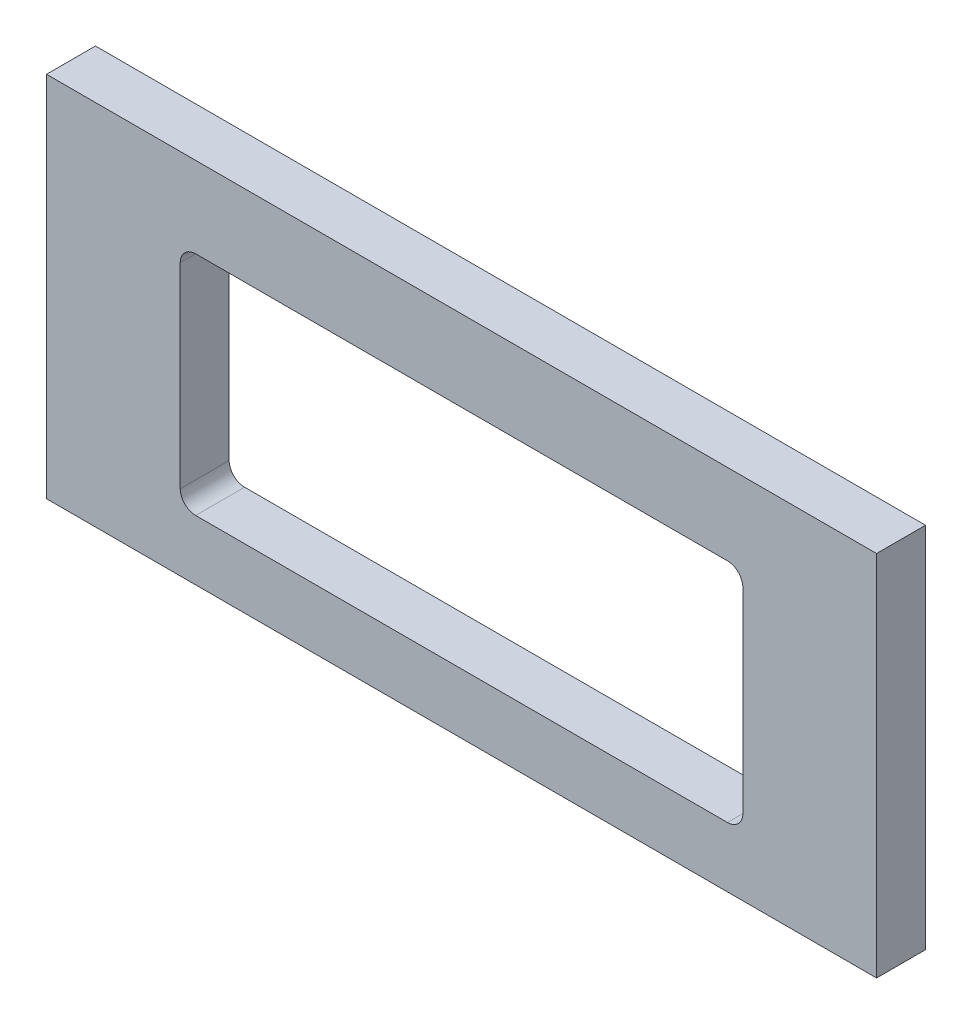
ISO-10303-21;
HEADER;
FILE_DESCRIPTION(('STEP AP214'),'2;1');
FILE_NAME('part.step','',(''),(''),'','','');
FILE_SCHEMA(('AUTOMOTIVE_DESIGN { 1 0 10303 214 1 1 1 1 }'));
ENDSEC;
DATA;
#1=APPLICATION_CONTEXT('core data for automotive mechanical design processes');
#2=APPLICATION_PROTOCOL_DEFINITION('international standard','automotive_design',2000,#1);
#3=PRODUCT_CONTEXT('',#1,'mechanical');
#4=PRODUCT('Part','Part','',(#3));
#5=PRODUCT_RELATED_PRODUCT_CATEGORY('part','',(#4));
#6=PRODUCT_DEFINITION_FORMATION('','',#4);
#7=PRODUCT_DEFINITION_CONTEXT('part definition',#1,'design');
#8=PRODUCT_DEFINITION('design','',#6,#7);
#9=PRODUCT_DEFINITION_SHAPE('','',#8);
#10=(LENGTH_UNIT() NAMED_UNIT(*) SI_UNIT(.MILLI.,.METRE.));
#11=(NAMED_UNIT(*) PLANE_ANGLE_UNIT() SI_UNIT($,.RADIAN.));
#12=(NAMED_UNIT(*) SI_UNIT($,.STERADIAN.) SOLID_ANGLE_UNIT());
#13=UNCERTAINTY_MEASURE_WITH_UNIT(LENGTH_MEASURE(1.E-05),#10,'distance_accuracy_value','');
#14=(GEOMETRIC_REPRESENTATION_CONTEXT(3) GLOBAL_UNCERTAINTY_ASSIGNED_CONTEXT((#13)) GLOBAL_UNIT_ASSIGNED_CONTEXT((#10,
#11,#12)) REPRESENTATION_CONTEXT('',''));
#15=CARTESIAN_POINT('',(0.,0.,0.));
#16=DIRECTION('',(0.,0.,1.));
#17=DIRECTION('',(1.,0.,0.));
#18=AXIS2_PLACEMENT_3D('',#15,#16,#17);
#19=CARTESIAN_POINT('',(53.85,47.7,6.35));
#20=DIRECTION('',(0.,-1.,0.));
#21=DIRECTION('',(1.,0.,0.));
#22=AXIS2_PLACEMENT_3D('',#19,#20,#21);
#23=PLANE('',#22);
#24=DIRECTION('',(-1.,0.,0.));
#25=VECTOR('',#24,1.);
#26=CARTESIAN_POINT('',(53.85,47.7,0.));
#27=LINE('',#26,#25);
#28=CARTESIAN_POINT('',(53.85,47.7,0.));
#29=VERTEX_POINT('',#28);
#30=CARTESIAN_POINT('',(-53.85,47.7,0.));
#31=VERTEX_POINT('',#30);
#32=EDGE_CURVE('E167',#29,#31,#27,.T.);
#33=ORIENTED_EDGE('',*,*,#32,.T.);
#34=DIRECTION('',(0.,0.,-1.));
#35=VECTOR('',#34,1.);
#36=CARTESIAN_POINT('',(-53.85,47.7,6.35));
#37=LINE('',#36,#35);
#38=CARTESIAN_POINT('',(-53.85,47.7,6.35));
#39=VERTEX_POINT('',#38);
#40=EDGE_CURVE('E12',#39,#31,#37,.T.);
#41=ORIENTED_EDGE('',*,*,#40,.F.);
#42=DIRECTION('',(-1.,0.,0.));
#43=VECTOR('',#42,1.);
#44=CARTESIAN_POINT('',(53.85,47.7,6.35));
#45=LINE('',#44,#43);
#46=CARTESIAN_POINT('',(53.85,47.7,6.35));
#47=VERTEX_POINT('',#46);
#48=EDGE_CURVE('E228',#47,#39,#45,.T.);
#49=ORIENTED_EDGE('',*,*,#48,.F.);
#50=DIRECTION('',(0.,0.,-1.));
#51=VECTOR('',#50,1.);
#52=CARTESIAN_POINT('',(53.85,47.7,6.35));
#53=LINE('',#52,#51);
#54=EDGE_CURVE('E239',#47,#29,#53,.T.);
#55=ORIENTED_EDGE('',*,*,#54,.T.);
#56=EDGE_LOOP('',(#33,#41,#49,#55));
#57=FACE_BOUND('',#56,.T.);
#58=ADVANCED_FACE('F73',(#57),#23,.F.);
#59=CARTESIAN_POINT('',(-53.85,0.,6.35));
#60=DIRECTION('',(-1.,0.,0.));
#61=DIRECTION('',(0.,-1.,0.));
#62=AXIS2_PLACEMENT_3D('',#59,#60,#61);
#63=PLANE('',#62);
#64=DIRECTION('',(0.,1.,0.));
#65=VECTOR('',#64,1.);
#66=CARTESIAN_POINT('',(-53.85,0.,0.));
#67=LINE('',#66,#65);
#68=CARTESIAN_POINT('',(-53.85,0.,0.));
#69=VERTEX_POINT('',#68);
#70=EDGE_CURVE('E242',#69,#31,#67,.T.);
#71=ORIENTED_EDGE('',*,*,#70,.F.);
#72=DIRECTION('',(0.,0.,-1.));
#73=VECTOR('',#72,1.);
#74=CARTESIAN_POINT('',(-53.85,0.,6.35));
#75=LINE('',#74,#73);
#76=CARTESIAN_POINT('',(-53.85,0.,6.35));
#77=VERTEX_POINT('',#76);
#78=EDGE_CURVE('E80',#77,#69,#75,.T.);
#79=ORIENTED_EDGE('',*,*,#78,.F.);
#80=DIRECTION('',(0.,1.,0.));
#81=VECTOR('',#80,1.);
#82=CARTESIAN_POINT('',(-53.85,0.,6.35));
#83=LINE('',#82,#81);
#84=EDGE_CURVE('E230',#77,#39,#83,.T.);
#85=ORIENTED_EDGE('',*,*,#84,.T.);
#86=ORIENTED_EDGE('',*,*,#40,.T.);
#87=EDGE_LOOP('',(#71,#79,#85,#86));
#88=FACE_BOUND('',#87,.T.);
#89=ADVANCED_FACE('F259',(#88),#63,.T.);
#90=CARTESIAN_POINT('',(53.85,0.,6.35));
#91=DIRECTION('',(0.,-1.,0.));
#92=DIRECTION('',(0.,0.,-1.));
#93=AXIS2_PLACEMENT_3D('',#90,#91,#92);
#94=PLANE('',#93);
#95=DIRECTION('',(-1.,0.,0.));
#96=VECTOR('',#95,1.);
#97=CARTESIAN_POINT('',(53.85,0.,0.));
#98=LINE('',#97,#96);
#99=CARTESIAN_POINT('',(53.85,0.,0.));
#100=VERTEX_POINT('',#99);
#101=EDGE_CURVE('E245',#100,#69,#98,.T.);
#102=ORIENTED_EDGE('',*,*,#101,.F.);
#103=DIRECTION('',(0.,0.,-1.));
#104=VECTOR('',#103,1.);
#105=CARTESIAN_POINT('',(53.85,0.,6.35));
#106=LINE('',#105,#104);
#107=CARTESIAN_POINT('',(53.85,0.,6.35));
#108=VERTEX_POINT('',#107);
#109=EDGE_CURVE('E251',#108,#100,#106,.T.);
#110=ORIENTED_EDGE('',*,*,#109,.F.);
#111=DIRECTION('',(-1.,0.,0.));
#112=VECTOR('',#111,1.);
#113=CARTESIAN_POINT('',(53.85,0.,6.35));
#114=LINE('',#113,#112);
#115=EDGE_CURVE('E234',#108,#77,#114,.T.);
#116=ORIENTED_EDGE('',*,*,#115,.T.);
#117=ORIENTED_EDGE('',*,*,#78,.T.);
#118=EDGE_LOOP('',(#102,#110,#116,#117));
#119=FACE_BOUND('',#118,.T.);
#120=ADVANCED_FACE('F255',(#119),#94,.T.);
#121=CARTESIAN_POINT('',(53.85,0.,6.35));
#122=DIRECTION('',(-1.,0.,0.));
#123=DIRECTION('',(0.,-1.,0.));
#124=AXIS2_PLACEMENT_3D('',#121,#122,#123);
#125=PLANE('',#124);
#126=DIRECTION('',(0.,1.,0.));
#127=VECTOR('',#126,1.);
#128=CARTESIAN_POINT('',(53.85,0.,0.));
#129=LINE('',#128,#127);
#130=EDGE_CURVE('E231',#100,#29,#129,.T.);
#131=ORIENTED_EDGE('',*,*,#130,.T.);
#132=ORIENTED_EDGE('',*,*,#54,.F.);
#133=DIRECTION('',(0.,1.,0.));
#134=VECTOR('',#133,1.);
#135=CARTESIAN_POINT('',(53.85,0.,6.35));
#136=LINE('',#135,#134);
#137=EDGE_CURVE('E237',#108,#47,#136,.T.);
#138=ORIENTED_EDGE('',*,*,#137,.F.);
#139=ORIENTED_EDGE('',*,*,#109,.T.);
#140=EDGE_LOOP('',(#131,#132,#138,#139));
#141=FACE_BOUND('',#140,.T.);
#142=ADVANCED_FACE('F267',(#141),#125,.F.);
#143=CARTESIAN_POINT('',(0.,0.,6.35));
#144=DIRECTION('',(0.,0.,-1.));
#145=DIRECTION('',(-1.,0.,0.));
#146=AXIS2_PLACEMENT_3D('',#143,#144,#145);
#147=PLANE('',#146);
#148=CARTESIAN_POINT('',(34.5000120000002,9.8,6.35));
#149=DIRECTION('',(0.,0.,1.));
#150=DIRECTION('',(1.,0.,0.));
#151=AXIS2_PLACEMENT_3D('',#148,#149,#150);
#152=CIRCLE('',#151,2.);
#153=CARTESIAN_POINT('',(34.5000120000002,7.8,6.35));
#154=VERTEX_POINT('',#153);
#155=CARTESIAN_POINT('',(36.5000120000002,9.8,6.35));
#156=VERTEX_POINT('',#155);
#157=EDGE_CURVE('E163',#154,#156,#152,.T.);
#158=ORIENTED_EDGE('',*,*,#157,.F.);
#159=DIRECTION('',(-1.,0.,0.));
#160=VECTOR('',#159,1.);
#161=CARTESIAN_POINT('',(0.,7.8,6.35));
#162=LINE('',#161,#160);
#163=CARTESIAN_POINT('',(-34.4999879999998,7.79999999999999,6.35));
#164=VERTEX_POINT('',#163);
#165=EDGE_CURVE('E171',#154,#164,#162,.T.);
#166=ORIENTED_EDGE('',*,*,#165,.T.);
#167=CARTESIAN_POINT('',(-34.4999879999998,9.79999999999999,6.35));
#168=DIRECTION('',(0.,0.,1.));
#169=DIRECTION('',(1.,0.,0.));
#170=AXIS2_PLACEMENT_3D('',#167,#168,#169);
#171=CIRCLE('',#170,2.);
#172=CARTESIAN_POINT('',(-36.4999879999998,9.79999999999999,6.35));
#173=VERTEX_POINT('',#172);
#174=EDGE_CURVE('E195',#164,#173,#171,.F.);
#175=ORIENTED_EDGE('',*,*,#174,.T.);
#176=DIRECTION('',(0.,1.,0.));
#177=VECTOR('',#176,1.);
#178=CARTESIAN_POINT('',(-36.4999879999998,0.,6.35));
#179=LINE('',#178,#177);
#180=CARTESIAN_POINT('',(-36.4999879999998,35.2,6.35));
#181=VERTEX_POINT('',#180);
#182=EDGE_CURVE('E87',#173,#181,#179,.T.);
#183=ORIENTED_EDGE('',*,*,#182,.T.);
#184=CARTESIAN_POINT('',(-34.4999879999998,35.2,6.35));
#185=DIRECTION('',(0.,0.,1.));
#186=DIRECTION('',(1.,0.,0.));
#187=AXIS2_PLACEMENT_3D('',#184,#185,#186);
#188=CIRCLE('',#187,2.00000000000001);
#189=CARTESIAN_POINT('',(-34.4999879999998,37.2,6.35));
#190=VERTEX_POINT('',#189);
#191=EDGE_CURVE('E191',#181,#190,#188,.F.);
#192=ORIENTED_EDGE('',*,*,#191,.T.);
#193=DIRECTION('',(-1.,0.,0.));
#194=VECTOR('',#193,1.);
#195=CARTESIAN_POINT('',(0.,37.2,6.35));
#196=LINE('',#195,#194);
#197=CARTESIAN_POINT('',(34.5000120000002,37.2,6.35));
#198=VERTEX_POINT('',#197);
#199=EDGE_CURVE('E189',#198,#190,#196,.T.);
#200=ORIENTED_EDGE('',*,*,#199,.F.);
#201=CARTESIAN_POINT('',(34.5000120000002,35.2,6.35));
#202=DIRECTION('',(0.,0.,1.));
#203=DIRECTION('',(1.,0.,0.));
#204=AXIS2_PLACEMENT_3D('',#201,#202,#203);
#205=CIRCLE('',#204,2.);
#206=CARTESIAN_POINT('',(36.5000120000002,35.2,6.35));
#207=VERTEX_POINT('',#206);
#208=EDGE_CURVE('E185',#198,#207,#205,.F.);
#209=ORIENTED_EDGE('',*,*,#208,.T.);
#210=DIRECTION('',(0.,1.,0.));
#211=VECTOR('',#210,1.);
#212=CARTESIAN_POINT('',(36.5000120000002,0.,6.35));
#213=LINE('',#212,#211);
#214=EDGE_CURVE('E183',#156,#207,#213,.T.);
#215=ORIENTED_EDGE('',*,*,#214,.F.);
#216=EDGE_LOOP('',(#158,#166,#175,#183,#192,#200,#209,#215));
#217=FACE_BOUND('',#216,.T.);
#218=ORIENTED_EDGE('',*,*,#48,.T.);
#219=ORIENTED_EDGE('',*,*,#84,.F.);
#220=ORIENTED_EDGE('',*,*,#115,.F.);
#221=ORIENTED_EDGE('',*,*,#137,.T.);
#222=EDGE_LOOP('',(#218,#219,#220,#221));
#223=FACE_BOUND('',#222,.T.);
#224=ADVANCED_FACE('F180',(#217,#223),#147,.F.);
#225=CARTESIAN_POINT('',(0.,0.,0.));
#226=DIRECTION('',(0.,0.,-1.));
#227=DIRECTION('',(-1.,0.,0.));
#228=AXIS2_PLACEMENT_3D('',#225,#226,#227);
#229=PLANE('',#228);
#230=DIRECTION('',(-1.,0.,0.));
#231=VECTOR('',#230,1.);
#232=CARTESIAN_POINT('',(0.,7.8,0.));
#233=LINE('',#232,#231);
#234=CARTESIAN_POINT('',(34.5000120000002,7.8,0.));
#235=VERTEX_POINT('',#234);
#236=CARTESIAN_POINT('',(-34.4999879999998,7.79999999999999,0.));
#237=VERTEX_POINT('',#236);
#238=EDGE_CURVE('E95',#235,#237,#233,.T.);
#239=ORIENTED_EDGE('',*,*,#238,.F.);
#240=CARTESIAN_POINT('',(34.5000120000002,9.8,0.));
#241=DIRECTION('',(0.,0.,1.));
#242=DIRECTION('',(1.,0.,0.));
#243=AXIS2_PLACEMENT_3D('',#240,#241,#242);
#244=CIRCLE('',#243,2.);
#245=CARTESIAN_POINT('',(36.5000120000002,9.8,0.));
#246=VERTEX_POINT('',#245);
#247=EDGE_CURVE('E166',#235,#246,#244,.T.);
#248=ORIENTED_EDGE('',*,*,#247,.T.);
#249=DIRECTION('',(0.,1.,0.));
#250=VECTOR('',#249,1.);
#251=CARTESIAN_POINT('',(36.5000120000002,0.,0.));
#252=LINE('',#251,#250);
#253=CARTESIAN_POINT('',(36.5000120000002,35.2,0.));
#254=VERTEX_POINT('',#253);
#255=EDGE_CURVE('E199',#246,#254,#252,.T.);
#256=ORIENTED_EDGE('',*,*,#255,.T.);
#257=CARTESIAN_POINT('',(34.5000120000002,35.2,0.));
#258=DIRECTION('',(0.,0.,1.));
#259=DIRECTION('',(1.,0.,0.));
#260=AXIS2_PLACEMENT_3D('',#257,#258,#259);
#261=CIRCLE('',#260,2.);
#262=CARTESIAN_POINT('',(34.5000120000002,37.2,0.));
#263=VERTEX_POINT('',#262);
#264=EDGE_CURVE('E202',#263,#254,#261,.F.);
#265=ORIENTED_EDGE('',*,*,#264,.F.);
#266=DIRECTION('',(-1.,0.,0.));
#267=VECTOR('',#266,1.);
#268=CARTESIAN_POINT('',(0.,37.2,0.));
#269=LINE('',#268,#267);
#270=CARTESIAN_POINT('',(-34.4999879999998,37.2,0.));
#271=VERTEX_POINT('',#270);
#272=EDGE_CURVE('E205',#263,#271,#269,.T.);
#273=ORIENTED_EDGE('',*,*,#272,.T.);
#274=CARTESIAN_POINT('',(-34.4999879999998,35.2,0.));
#275=DIRECTION('',(0.,0.,1.));
#276=DIRECTION('',(1.,0.,0.));
#277=AXIS2_PLACEMENT_3D('',#274,#275,#276);
#278=CIRCLE('',#277,2.00000000000001);
#279=CARTESIAN_POINT('',(-36.4999879999998,35.2,0.));
#280=VERTEX_POINT('',#279);
#281=EDGE_CURVE('E208',#280,#271,#278,.F.);
#282=ORIENTED_EDGE('',*,*,#281,.F.);
#283=DIRECTION('',(0.,1.,0.));
#284=VECTOR('',#283,1.);
#285=CARTESIAN_POINT('',(-36.4999879999998,0.,0.));
#286=LINE('',#285,#284);
#287=CARTESIAN_POINT('',(-36.4999879999998,9.79999999999999,0.));
#288=VERTEX_POINT('',#287);
#289=EDGE_CURVE('E211',#288,#280,#286,.T.);
#290=ORIENTED_EDGE('',*,*,#289,.F.);
#291=CARTESIAN_POINT('',(-34.4999879999998,9.79999999999999,0.));
#292=DIRECTION('',(0.,0.,1.));
#293=DIRECTION('',(1.,0.,0.));
#294=AXIS2_PLACEMENT_3D('',#291,#292,#293);
#295=CIRCLE('',#294,2.);
#296=EDGE_CURVE('E177',#237,#288,#295,.F.);
#297=ORIENTED_EDGE('',*,*,#296,.F.);
#298=EDGE_LOOP('',(#239,#248,#256,#265,#273,#282,#290,#297));
#299=FACE_BOUND('',#298,.T.);
#300=ORIENTED_EDGE('',*,*,#32,.F.);
#301=ORIENTED_EDGE('',*,*,#130,.F.);
#302=ORIENTED_EDGE('',*,*,#101,.T.);
#303=ORIENTED_EDGE('',*,*,#70,.T.);
#304=EDGE_LOOP('',(#300,#301,#302,#303));
#305=FACE_BOUND('',#304,.T.);
#306=ADVANCED_FACE('F264',(#299,#305),#229,.T.);
#307=CARTESIAN_POINT('',(0.,7.8,6.35));
#308=DIRECTION('',(0.,-1.,0.));
#309=DIRECTION('',(1.,0.,0.));
#310=AXIS2_PLACEMENT_3D('',#307,#308,#309);
#311=PLANE('',#310);
#312=ORIENTED_EDGE('',*,*,#238,.T.);
#313=DIRECTION('',(0.,0.,-1.));
#314=VECTOR('',#313,1.);
#315=CARTESIAN_POINT('',(-34.4999879999998,7.79999999999999,6.35));
#316=LINE('',#315,#314);
#317=EDGE_CURVE('E173',#164,#237,#316,.T.);
#318=ORIENTED_EDGE('',*,*,#317,.F.);
#319=ORIENTED_EDGE('',*,*,#165,.F.);
#320=DIRECTION('',(0.,0.,-1.));
#321=VECTOR('',#320,1.);
#322=CARTESIAN_POINT('',(34.5000120000002,7.8,6.35));
#323=LINE('',#322,#321);
#324=EDGE_CURVE('E159',#154,#235,#323,.T.);
#325=ORIENTED_EDGE('',*,*,#324,.T.);
#326=EDGE_LOOP('',(#312,#318,#319,#325));
#327=FACE_BOUND('',#326,.T.);
#328=ADVANCED_FACE('F172',(#327),#311,.F.);
#329=CARTESIAN_POINT('',(34.5000120000002,9.8,6.35));
#330=DIRECTION('',(0.,0.,-1.));
#331=DIRECTION('',(-1.,0.,0.));
#332=AXIS2_PLACEMENT_3D('',#329,#330,#331);
#333=CYLINDRICAL_SURFACE('',#332,2.);
#334=ORIENTED_EDGE('',*,*,#247,.F.);
#335=ORIENTED_EDGE('',*,*,#324,.F.);
#336=ORIENTED_EDGE('',*,*,#157,.T.);
#337=DIRECTION('',(0.,0.,-1.));
#338=VECTOR('',#337,1.);
#339=CARTESIAN_POINT('',(36.5000120000002,9.8,6.35));
#340=LINE('',#339,#338);
#341=EDGE_CURVE('E168',#156,#246,#340,.T.);
#342=ORIENTED_EDGE('',*,*,#341,.T.);
#343=EDGE_LOOP('',(#334,#335,#336,#342));
#344=FACE_BOUND('',#343,.T.);
#345=ADVANCED_FACE('F161',(#344),#333,.F.);
#346=CARTESIAN_POINT('',(36.5000120000002,0.,6.35));
#347=DIRECTION('',(-1.,0.,0.));
#348=DIRECTION('',(0.,0.,1.));
#349=AXIS2_PLACEMENT_3D('',#346,#347,#348);
#350=PLANE('',#349);
#351=ORIENTED_EDGE('',*,*,#255,.F.);
#352=ORIENTED_EDGE('',*,*,#341,.F.);
#353=ORIENTED_EDGE('',*,*,#214,.T.);
#354=DIRECTION('',(0.,0.,-1.));
#355=VECTOR('',#354,1.);
#356=CARTESIAN_POINT('',(36.5000120000002,35.2,6.35));
#357=LINE('',#356,#355);
#358=EDGE_CURVE('E225',#207,#254,#357,.T.);
#359=ORIENTED_EDGE('',*,*,#358,.T.);
#360=EDGE_LOOP('',(#351,#352,#353,#359));
#361=FACE_BOUND('',#360,.T.);
#362=ADVANCED_FACE('F325',(#361),#350,.T.);
#363=CARTESIAN_POINT('',(34.5000120000002,35.2,6.35));
#364=DIRECTION('',(0.,0.,-1.));
#365=DIRECTION('',(-1.,0.,0.));
#366=AXIS2_PLACEMENT_3D('',#363,#364,#365);
#367=CYLINDRICAL_SURFACE('',#366,2.);
#368=ORIENTED_EDGE('',*,*,#264,.T.);
#369=ORIENTED_EDGE('',*,*,#358,.F.);
#370=ORIENTED_EDGE('',*,*,#208,.F.);
#371=DIRECTION('',(0.,0.,-1.));
#372=VECTOR('',#371,1.);
#373=CARTESIAN_POINT('',(34.5000120000002,37.2,6.35));
#374=LINE('',#373,#372);
#375=EDGE_CURVE('E223',#198,#263,#374,.T.);
#376=ORIENTED_EDGE('',*,*,#375,.T.);
#377=EDGE_LOOP('',(#368,#369,#370,#376));
#378=FACE_BOUND('',#377,.T.);
#379=ADVANCED_FACE('F335',(#378),#367,.F.);
#380=CARTESIAN_POINT('',(0.,37.2,6.35));
#381=DIRECTION('',(0.,-1.,0.));
#382=DIRECTION('',(0.,0.,-1.));
#383=AXIS2_PLACEMENT_3D('',#380,#381,#382);
#384=PLANE('',#383);
#385=ORIENTED_EDGE('',*,*,#272,.F.);
#386=ORIENTED_EDGE('',*,*,#375,.F.);
#387=ORIENTED_EDGE('',*,*,#199,.T.);
#388=DIRECTION('',(0.,0.,-1.));
#389=VECTOR('',#388,1.);
#390=CARTESIAN_POINT('',(-34.4999879999998,37.2,6.35));
#391=LINE('',#390,#389);
#392=EDGE_CURVE('E221',#190,#271,#391,.T.);
#393=ORIENTED_EDGE('',*,*,#392,.T.);
#394=EDGE_LOOP('',(#385,#386,#387,#393));
#395=FACE_BOUND('',#394,.T.);
#396=ADVANCED_FACE('F346',(#395),#384,.T.);
#397=CARTESIAN_POINT('',(-34.4999879999998,35.2,6.35));
#398=DIRECTION('',(0.,0.,-1.));
#399=DIRECTION('',(-1.,0.,0.));
#400=AXIS2_PLACEMENT_3D('',#397,#398,#399);
#401=CYLINDRICAL_SURFACE('',#400,2.00000000000001);
#402=ORIENTED_EDGE('',*,*,#281,.T.);
#403=ORIENTED_EDGE('',*,*,#392,.F.);
#404=ORIENTED_EDGE('',*,*,#191,.F.);
#405=DIRECTION('',(0.,0.,-1.));
#406=VECTOR('',#405,1.);
#407=CARTESIAN_POINT('',(-36.4999879999998,35.2,6.35));
#408=LINE('',#407,#406);
#409=EDGE_CURVE('E219',#181,#280,#408,.T.);
#410=ORIENTED_EDGE('',*,*,#409,.T.);
#411=EDGE_LOOP('',(#402,#403,#404,#410));
#412=FACE_BOUND('',#411,.T.);
#413=ADVANCED_FACE('F357',(#412),#401,.F.);
#414=CARTESIAN_POINT('',(-36.4999879999998,0.,6.35));
#415=DIRECTION('',(-1.,0.,0.));
#416=DIRECTION('',(0.,0.,1.));
#417=AXIS2_PLACEMENT_3D('',#414,#415,#416);
#418=PLANE('',#417);
#419=ORIENTED_EDGE('',*,*,#289,.T.);
#420=ORIENTED_EDGE('',*,*,#409,.F.);
#421=ORIENTED_EDGE('',*,*,#182,.F.);
#422=DIRECTION('',(0.,0.,-1.));
#423=VECTOR('',#422,1.);
#424=CARTESIAN_POINT('',(-36.4999879999998,9.79999999999999,6.35));
#425=LINE('',#424,#423);
#426=EDGE_CURVE('E217',#173,#288,#425,.T.);
#427=ORIENTED_EDGE('',*,*,#426,.T.);
#428=EDGE_LOOP('',(#419,#420,#421,#427));
#429=FACE_BOUND('',#428,.T.);
#430=ADVANCED_FACE('F368',(#429),#418,.F.);
#431=CARTESIAN_POINT('',(-34.4999879999998,9.79999999999999,6.35));
#432=DIRECTION('',(0.,0.,-1.));
#433=DIRECTION('',(-1.,0.,0.));
#434=AXIS2_PLACEMENT_3D('',#431,#432,#433);
#435=CYLINDRICAL_SURFACE('',#434,2.);
#436=ORIENTED_EDGE('',*,*,#296,.T.);
#437=ORIENTED_EDGE('',*,*,#426,.F.);
#438=ORIENTED_EDGE('',*,*,#174,.F.);
#439=ORIENTED_EDGE('',*,*,#317,.T.);
#440=EDGE_LOOP('',(#436,#437,#438,#439));
#441=FACE_BOUND('',#440,.T.);
#442=ADVANCED_FACE('F379',(#441),#435,.F.);
#443=CLOSED_SHELL('',(#58,#89,#120,#142,#224,#306,#328,#345,#362,#379,#396,#413,#430,#442));
#444=MANIFOLD_SOLID_BREP('B2',#443);
#445=ADVANCED_BREP_SHAPE_REPRESENTATION('',(#18,#444),#14);
#446=SHAPE_DEFINITION_REPRESENTATION(#9,#445);
ENDSEC;
END-ISO-10303-21;
